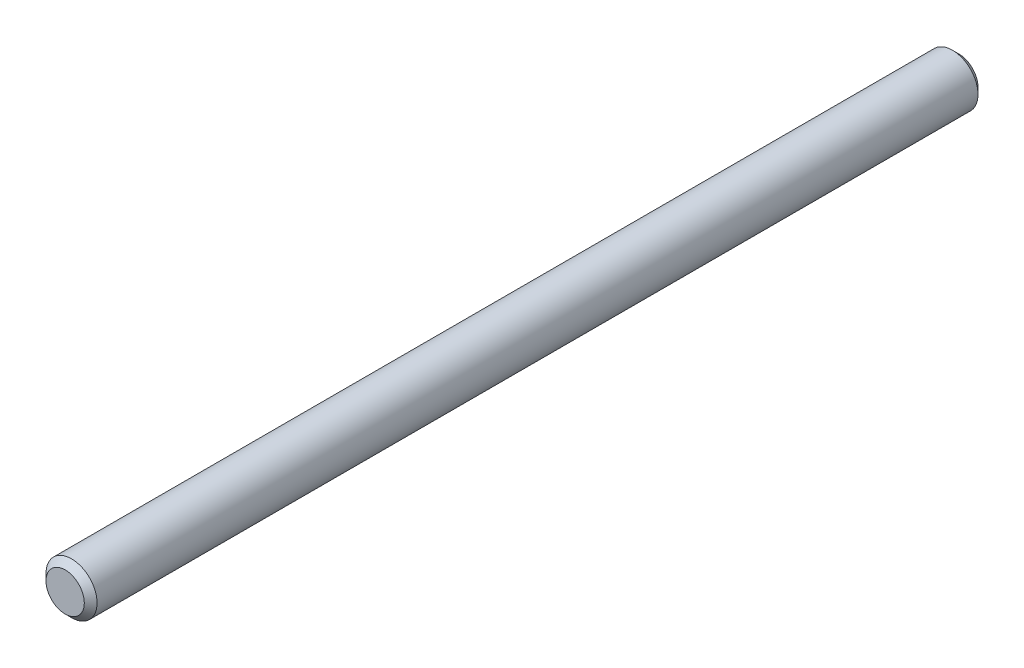
ISO-10303-21;
HEADER;
FILE_DESCRIPTION(('STEP AP214'),'2;1');
FILE_NAME('part.step','',(''),(''),'','','');
FILE_SCHEMA(('AUTOMOTIVE_DESIGN { 1 0 10303 214 1 1 1 1 }'));
ENDSEC;
DATA;
#1=APPLICATION_CONTEXT('core data for automotive mechanical design processes');
#2=APPLICATION_PROTOCOL_DEFINITION('international standard','automotive_design',2000,#1);
#3=PRODUCT_CONTEXT('',#1,'mechanical');
#4=PRODUCT('Part','Part','',(#3));
#5=PRODUCT_RELATED_PRODUCT_CATEGORY('part','',(#4));
#6=PRODUCT_DEFINITION_FORMATION('','',#4);
#7=PRODUCT_DEFINITION_CONTEXT('part definition',#1,'design');
#8=PRODUCT_DEFINITION('design','',#6,#7);
#9=PRODUCT_DEFINITION_SHAPE('','',#8);
#10=(LENGTH_UNIT() NAMED_UNIT(*) SI_UNIT(.MILLI.,.METRE.));
#11=(NAMED_UNIT(*) PLANE_ANGLE_UNIT() SI_UNIT($,.RADIAN.));
#12=(NAMED_UNIT(*) SI_UNIT($,.STERADIAN.) SOLID_ANGLE_UNIT());
#13=UNCERTAINTY_MEASURE_WITH_UNIT(LENGTH_MEASURE(1.E-05),#10,'distance_accuracy_value','');
#14=(GEOMETRIC_REPRESENTATION_CONTEXT(3) GLOBAL_UNCERTAINTY_ASSIGNED_CONTEXT((#13)) GLOBAL_UNIT_ASSIGNED_CONTEXT((#10,
#11,#12)) REPRESENTATION_CONTEXT('',''));
#15=CARTESIAN_POINT('',(0.,0.,0.));
#16=DIRECTION('',(0.,0.,1.));
#17=DIRECTION('',(1.,0.,0.));
#18=AXIS2_PLACEMENT_3D('',#15,#16,#17);
#19=CARTESIAN_POINT('',(0.,0.,140.));
#20=DIRECTION('',(0.,0.,-1.));
#21=DIRECTION('',(-1.,0.,0.));
#22=AXIS2_PLACEMENT_3D('',#19,#20,#21);
#23=CYLINDRICAL_SURFACE('',#22,4.);
#24=CARTESIAN_POINT('',(0.,0.,139.));
#25=DIRECTION('',(0.,0.,1.));
#26=DIRECTION('',(1.,0.,0.));
#27=AXIS2_PLACEMENT_3D('',#24,#25,#26);
#28=CIRCLE('',#27,4.);
#29=CARTESIAN_POINT('',(4.,0.,139.));
#30=VERTEX_POINT('',#29);
#31=EDGE_CURVE('E45',#30,#30,#28,.F.);
#32=ORIENTED_EDGE('',*,*,#31,.T.);
#33=EDGE_LOOP('',(#32));
#34=FACE_BOUND('',#33,.T.);
#35=CARTESIAN_POINT('',(0.,0.,1.));
#36=DIRECTION('',(0.,0.,1.));
#37=DIRECTION('',(1.,0.,0.));
#38=AXIS2_PLACEMENT_3D('',#35,#36,#37);
#39=CIRCLE('',#38,4.);
#40=CARTESIAN_POINT('',(4.,0.,1.));
#41=VERTEX_POINT('',#40);
#42=EDGE_CURVE('E50',#41,#41,#39,.T.);
#43=ORIENTED_EDGE('',*,*,#42,.T.);
#44=EDGE_LOOP('',(#43));
#45=FACE_BOUND('',#44,.T.);
#46=ADVANCED_FACE('F37',(#34,#45),#23,.T.);
#47=CARTESIAN_POINT('',(0.,0.,140.));
#48=DIRECTION('',(0.,0.,1.));
#49=DIRECTION('',(1.,0.,0.));
#50=AXIS2_PLACEMENT_3D('',#47,#48,#49);
#51=PLANE('',#50);
#52=CARTESIAN_POINT('',(0.,0.,140.));
#53=DIRECTION('',(0.,0.,1.));
#54=DIRECTION('',(1.,0.,0.));
#55=AXIS2_PLACEMENT_3D('',#52,#53,#54);
#56=CIRCLE('',#55,3.);
#57=CARTESIAN_POINT('',(3.,0.,140.));
#58=VERTEX_POINT('',#57);
#59=EDGE_CURVE('E55',#58,#58,#56,.T.);
#60=ORIENTED_EDGE('',*,*,#59,.T.);
#61=EDGE_LOOP('',(#60));
#62=FACE_BOUND('',#61,.T.);
#63=ADVANCED_FACE('F62',(#62),#51,.T.);
#64=CARTESIAN_POINT('',(0.,0.,0.));
#65=DIRECTION('',(0.,0.,1.));
#66=DIRECTION('',(1.,0.,0.));
#67=AXIS2_PLACEMENT_3D('',#64,#65,#66);
#68=PLANE('',#67);
#69=CARTESIAN_POINT('',(0.,0.,0.));
#70=DIRECTION('',(0.,0.,1.));
#71=DIRECTION('',(1.,0.,0.));
#72=AXIS2_PLACEMENT_3D('',#69,#70,#71);
#73=CIRCLE('',#72,2.99999999999999);
#74=CARTESIAN_POINT('',(2.99999999999999,0.,0.));
#75=VERTEX_POINT('',#74);
#76=EDGE_CURVE('E10',#75,#75,#73,.F.);
#77=ORIENTED_EDGE('',*,*,#76,.T.);
#78=EDGE_LOOP('',(#77));
#79=FACE_BOUND('',#78,.T.);
#80=ADVANCED_FACE('F66',(#79),#68,.F.);
#81=CARTESIAN_POINT('',(0.,0.,140.));
#82=DIRECTION('',(0.,0.,-1.));
#83=DIRECTION('',(-1.,0.,0.));
#84=AXIS2_PLACEMENT_3D('',#81,#82,#83);
#85=CONICAL_SURFACE('',#84,3.,0.785398163397447);
#86=ORIENTED_EDGE('',*,*,#31,.F.);
#87=EDGE_LOOP('',(#86));
#88=FACE_BOUND('',#87,.T.);
#89=ORIENTED_EDGE('',*,*,#59,.F.);
#90=EDGE_LOOP('',(#89));
#91=FACE_BOUND('',#90,.T.);
#92=ADVANCED_FACE('F64',(#88,#91),#85,.T.);
#93=CARTESIAN_POINT('',(0.,0.,1.));
#94=DIRECTION('',(0.,0.,1.));
#95=DIRECTION('',(1.,0.,0.));
#96=AXIS2_PLACEMENT_3D('',#93,#94,#95);
#97=CONICAL_SURFACE('',#96,4.,0.785398163397454);
#98=ORIENTED_EDGE('',*,*,#76,.F.);
#99=EDGE_LOOP('',(#98));
#100=FACE_BOUND('',#99,.T.);
#101=ORIENTED_EDGE('',*,*,#42,.F.);
#102=EDGE_LOOP('',(#101));
#103=FACE_BOUND('',#102,.T.);
#104=ADVANCED_FACE('F39',(#100,#103),#97,.T.);
#105=CLOSED_SHELL('',(#46,#63,#80,#92,#104));
#106=MANIFOLD_SOLID_BREP('B2',#105);
#107=ADVANCED_BREP_SHAPE_REPRESENTATION('',(#18,#106),#14);
#108=SHAPE_DEFINITION_REPRESENTATION(#9,#107);
ENDSEC;
END-ISO-10303-21;
